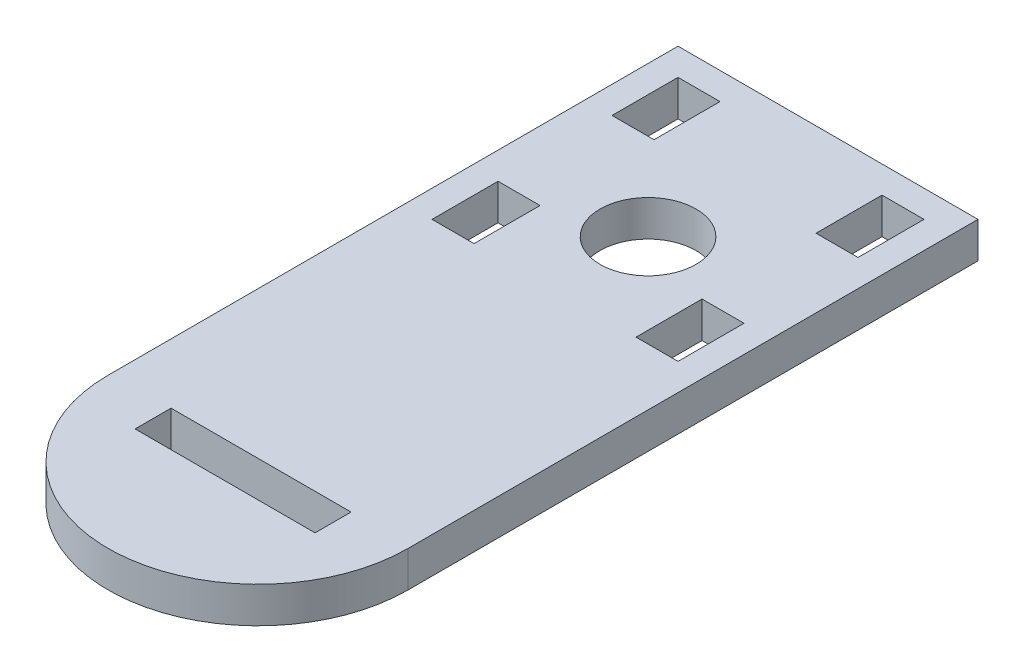
ISO-10303-21;
HEADER;
FILE_DESCRIPTION(('STEP AP214'),'2;1');
FILE_NAME('part.step','',(''),(''),'','','');
FILE_SCHEMA(('AUTOMOTIVE_DESIGN { 1 0 10303 214 1 1 1 1 }'));
ENDSEC;
DATA;
#1=APPLICATION_CONTEXT('core data for automotive mechanical design processes');
#2=APPLICATION_PROTOCOL_DEFINITION('international standard','automotive_design',2000,#1);
#3=PRODUCT_CONTEXT('',#1,'mechanical');
#4=PRODUCT('Part','Part','',(#3));
#5=PRODUCT_RELATED_PRODUCT_CATEGORY('part','',(#4));
#6=PRODUCT_DEFINITION_FORMATION('','',#4);
#7=PRODUCT_DEFINITION_CONTEXT('part definition',#1,'design');
#8=PRODUCT_DEFINITION('design','',#6,#7);
#9=PRODUCT_DEFINITION_SHAPE('','',#8);
#10=(LENGTH_UNIT() NAMED_UNIT(*) SI_UNIT(.MILLI.,.METRE.));
#11=(NAMED_UNIT(*) PLANE_ANGLE_UNIT() SI_UNIT($,.RADIAN.));
#12=(NAMED_UNIT(*) SI_UNIT($,.STERADIAN.) SOLID_ANGLE_UNIT());
#13=UNCERTAINTY_MEASURE_WITH_UNIT(LENGTH_MEASURE(1.E-05),#10,'distance_accuracy_value','');
#14=(GEOMETRIC_REPRESENTATION_CONTEXT(3) GLOBAL_UNCERTAINTY_ASSIGNED_CONTEXT((#13)) GLOBAL_UNIT_ASSIGNED_CONTEXT((#10,
#11,#12)) REPRESENTATION_CONTEXT('',''));
#15=CARTESIAN_POINT('',(0.,0.,0.));
#16=DIRECTION('',(0.,0.,1.));
#17=DIRECTION('',(1.,0.,0.));
#18=AXIS2_PLACEMENT_3D('',#15,#16,#17);
#19=CARTESIAN_POINT('',(-12.5,3.,47.5));
#20=DIRECTION('',(0.,1.,0.));
#21=DIRECTION('',(0.,0.,1.));
#22=AXIS2_PLACEMENT_3D('',#19,#20,#21);
#23=PLANE('',#22);
#24=DIRECTION('',(-1.,0.,0.));
#25=VECTOR('',#24,1.);
#26=CARTESIAN_POINT('',(-20.,3.,47.25));
#27=LINE('',#26,#25);
#28=CARTESIAN_POINT('',(-5.,3.,47.25));
#29=VERTEX_POINT('',#28);
#30=CARTESIAN_POINT('',(-20.,3.,47.25));
#31=VERTEX_POINT('',#30);
#32=EDGE_CURVE('E210',#29,#31,#27,.T.);
#33=ORIENTED_EDGE('',*,*,#32,.F.);
#34=DIRECTION('',(0.,0.,-1.));
#35=VECTOR('',#34,1.);
#36=CARTESIAN_POINT('',(-5.,3.,47.25));
#37=LINE('',#36,#35);
#38=CARTESIAN_POINT('',(-5.,3.,50.25));
#39=VERTEX_POINT('',#38);
#40=EDGE_CURVE('E201',#39,#29,#37,.T.);
#41=ORIENTED_EDGE('',*,*,#40,.F.);
#42=DIRECTION('',(1.,0.,0.));
#43=VECTOR('',#42,1.);
#44=CARTESIAN_POINT('',(-20.,3.,50.25));
#45=LINE('',#44,#43);
#46=CARTESIAN_POINT('',(-20.,3.,50.25));
#47=VERTEX_POINT('',#46);
#48=EDGE_CURVE('E228',#47,#39,#45,.T.);
#49=ORIENTED_EDGE('',*,*,#48,.F.);
#50=DIRECTION('',(0.,0.,1.));
#51=VECTOR('',#50,1.);
#52=CARTESIAN_POINT('',(-20.,3.,47.25));
#53=LINE('',#52,#51);
#54=EDGE_CURVE('E224',#31,#47,#53,.T.);
#55=ORIENTED_EDGE('',*,*,#54,.F.);
#56=EDGE_LOOP('',(#33,#41,#49,#55));
#57=FACE_BOUND('',#56,.T.);
#58=DIRECTION('',(1.,0.,0.));
#59=VECTOR('',#58,1.);
#60=CARTESIAN_POINT('',(-5.75,3.,22.75));
#61=LINE('',#60,#59);
#62=CARTESIAN_POINT('',(-5.75,3.,22.75));
#63=VERTEX_POINT('',#62);
#64=CARTESIAN_POINT('',(-2.25,3.,22.75));
#65=VERTEX_POINT('',#64);
#66=EDGE_CURVE('E255',#63,#65,#61,.T.);
#67=ORIENTED_EDGE('',*,*,#66,.F.);
#68=DIRECTION('',(0.,0.,1.));
#69=VECTOR('',#68,1.);
#70=CARTESIAN_POINT('',(-5.75,3.,17.25));
#71=LINE('',#70,#69);
#72=CARTESIAN_POINT('',(-5.75,3.,17.25));
#73=VERTEX_POINT('',#72);
#74=EDGE_CURVE('E252',#73,#63,#71,.T.);
#75=ORIENTED_EDGE('',*,*,#74,.F.);
#76=DIRECTION('',(-1.,0.,0.));
#77=VECTOR('',#76,1.);
#78=CARTESIAN_POINT('',(-5.75,3.,17.25));
#79=LINE('',#78,#77);
#80=CARTESIAN_POINT('',(-2.25,3.,17.25));
#81=VERTEX_POINT('',#80);
#82=EDGE_CURVE('E263',#81,#73,#79,.T.);
#83=ORIENTED_EDGE('',*,*,#82,.F.);
#84=DIRECTION('',(0.,0.,-1.));
#85=VECTOR('',#84,1.);
#86=CARTESIAN_POINT('',(-2.25,3.,17.25));
#87=LINE('',#86,#85);
#88=EDGE_CURVE('E259',#65,#81,#87,.T.);
#89=ORIENTED_EDGE('',*,*,#88,.F.);
#90=EDGE_LOOP('',(#67,#75,#83,#89));
#91=FACE_BOUND('',#90,.T.);
#92=DIRECTION('',(1.,0.,0.));
#93=VECTOR('',#92,1.);
#94=CARTESIAN_POINT('',(-22.75,3.,22.75));
#95=LINE('',#94,#93);
#96=CARTESIAN_POINT('',(-22.75,3.,22.75));
#97=VERTEX_POINT('',#96);
#98=CARTESIAN_POINT('',(-19.25,3.,22.75));
#99=VERTEX_POINT('',#98);
#100=EDGE_CURVE('E298',#97,#99,#95,.T.);
#101=ORIENTED_EDGE('',*,*,#100,.F.);
#102=DIRECTION('',(0.,0.,1.));
#103=VECTOR('',#102,1.);
#104=CARTESIAN_POINT('',(-22.75,3.,17.25));
#105=LINE('',#104,#103);
#106=CARTESIAN_POINT('',(-22.75,3.,17.25));
#107=VERTEX_POINT('',#106);
#108=EDGE_CURVE('E295',#107,#97,#105,.T.);
#109=ORIENTED_EDGE('',*,*,#108,.F.);
#110=DIRECTION('',(-1.,0.,0.));
#111=VECTOR('',#110,1.);
#112=CARTESIAN_POINT('',(-22.75,3.,17.25));
#113=LINE('',#112,#111);
#114=CARTESIAN_POINT('',(-19.25,3.,17.25));
#115=VERTEX_POINT('',#114);
#116=EDGE_CURVE('E306',#115,#107,#113,.T.);
#117=ORIENTED_EDGE('',*,*,#116,.F.);
#118=DIRECTION('',(0.,0.,-1.));
#119=VECTOR('',#118,1.);
#120=CARTESIAN_POINT('',(-19.25,3.,17.25));
#121=LINE('',#120,#119);
#122=EDGE_CURVE('E302',#99,#115,#121,.T.);
#123=ORIENTED_EDGE('',*,*,#122,.F.);
#124=EDGE_LOOP('',(#101,#109,#117,#123));
#125=FACE_BOUND('',#124,.T.);
#126=DIRECTION('',(1.,0.,0.));
#127=VECTOR('',#126,1.);
#128=CARTESIAN_POINT('',(-5.75,3.,7.75));
#129=LINE('',#128,#127);
#130=CARTESIAN_POINT('',(-5.75,3.,7.75));
#131=VERTEX_POINT('',#130);
#132=CARTESIAN_POINT('',(-2.25,3.,7.75));
#133=VERTEX_POINT('',#132);
#134=EDGE_CURVE('E341',#131,#133,#129,.T.);
#135=ORIENTED_EDGE('',*,*,#134,.F.);
#136=DIRECTION('',(0.,0.,1.));
#137=VECTOR('',#136,1.);
#138=CARTESIAN_POINT('',(-5.75,3.,2.25));
#139=LINE('',#138,#137);
#140=CARTESIAN_POINT('',(-5.75,3.,2.25));
#141=VERTEX_POINT('',#140);
#142=EDGE_CURVE('E338',#141,#131,#139,.T.);
#143=ORIENTED_EDGE('',*,*,#142,.F.);
#144=DIRECTION('',(-1.,0.,0.));
#145=VECTOR('',#144,1.);
#146=CARTESIAN_POINT('',(-5.75,3.,2.25));
#147=LINE('',#146,#145);
#148=CARTESIAN_POINT('',(-2.25,3.,2.25));
#149=VERTEX_POINT('',#148);
#150=EDGE_CURVE('E349',#149,#141,#147,.T.);
#151=ORIENTED_EDGE('',*,*,#150,.F.);
#152=DIRECTION('',(0.,0.,-1.));
#153=VECTOR('',#152,1.);
#154=CARTESIAN_POINT('',(-2.25,3.,2.25));
#155=LINE('',#154,#153);
#156=EDGE_CURVE('E345',#133,#149,#155,.T.);
#157=ORIENTED_EDGE('',*,*,#156,.F.);
#158=EDGE_LOOP('',(#135,#143,#151,#157));
#159=FACE_BOUND('',#158,.T.);
#160=DIRECTION('',(1.,0.,0.));
#161=VECTOR('',#160,1.);
#162=CARTESIAN_POINT('',(-22.75,3.,7.75));
#163=LINE('',#162,#161);
#164=CARTESIAN_POINT('',(-22.75,3.,7.75));
#165=VERTEX_POINT('',#164);
#166=CARTESIAN_POINT('',(-19.25,3.,7.75));
#167=VERTEX_POINT('',#166);
#168=EDGE_CURVE('E384',#165,#167,#163,.T.);
#169=ORIENTED_EDGE('',*,*,#168,.F.);
#170=DIRECTION('',(0.,0.,1.));
#171=VECTOR('',#170,1.);
#172=CARTESIAN_POINT('',(-22.75,3.,2.25));
#173=LINE('',#172,#171);
#174=CARTESIAN_POINT('',(-22.75,3.,2.25));
#175=VERTEX_POINT('',#174);
#176=EDGE_CURVE('E381',#175,#165,#173,.T.);
#177=ORIENTED_EDGE('',*,*,#176,.F.);
#178=DIRECTION('',(-1.,0.,0.));
#179=VECTOR('',#178,1.);
#180=CARTESIAN_POINT('',(-22.75,3.,2.25));
#181=LINE('',#180,#179);
#182=CARTESIAN_POINT('',(-19.25,3.,2.25));
#183=VERTEX_POINT('',#182);
#184=EDGE_CURVE('E392',#183,#175,#181,.T.);
#185=ORIENTED_EDGE('',*,*,#184,.F.);
#186=DIRECTION('',(0.,0.,-1.));
#187=VECTOR('',#186,1.);
#188=CARTESIAN_POINT('',(-19.25,3.,2.25));
#189=LINE('',#188,#187);
#190=EDGE_CURVE('E388',#167,#183,#189,.T.);
#191=ORIENTED_EDGE('',*,*,#190,.F.);
#192=EDGE_LOOP('',(#169,#177,#185,#191));
#193=FACE_BOUND('',#192,.T.);
#194=DIRECTION('',(0.,0.,-1.));
#195=VECTOR('',#194,1.);
#196=CARTESIAN_POINT('',(0.,3.,0.));
#197=LINE('',#196,#195);
#198=CARTESIAN_POINT('',(0.,3.,47.5));
#199=VERTEX_POINT('',#198);
#200=CARTESIAN_POINT('',(0.,3.,0.));
#201=VERTEX_POINT('',#200);
#202=EDGE_CURVE('E424',#199,#201,#197,.T.);
#203=ORIENTED_EDGE('',*,*,#202,.T.);
#204=DIRECTION('',(-1.,0.,0.));
#205=VECTOR('',#204,1.);
#206=CARTESIAN_POINT('',(0.,3.,0.));
#207=LINE('',#206,#205);
#208=CARTESIAN_POINT('',(-25.,3.,0.));
#209=VERTEX_POINT('',#208);
#210=EDGE_CURVE('E428',#201,#209,#207,.T.);
#211=ORIENTED_EDGE('',*,*,#210,.T.);
#212=DIRECTION('',(0.,0.,1.));
#213=VECTOR('',#212,1.);
#214=CARTESIAN_POINT('',(-25.,3.,0.));
#215=LINE('',#214,#213);
#216=CARTESIAN_POINT('',(-25.,3.,47.5));
#217=VERTEX_POINT('',#216);
#218=EDGE_CURVE('E432',#209,#217,#215,.T.);
#219=ORIENTED_EDGE('',*,*,#218,.T.);
#220=CARTESIAN_POINT('',(-12.5,3.,47.5));
#221=DIRECTION('',(0.,1.,0.));
#222=DIRECTION('',(0.,0.,1.));
#223=AXIS2_PLACEMENT_3D('',#220,#221,#222);
#224=CIRCLE('',#223,12.5);
#225=EDGE_CURVE('E435',#217,#199,#224,.T.);
#226=ORIENTED_EDGE('',*,*,#225,.T.);
#227=EDGE_LOOP('',(#203,#211,#219,#226));
#228=FACE_BOUND('',#227,.T.);
#229=CARTESIAN_POINT('',(-12.5,3.,15.));
#230=DIRECTION('',(0.,1.,0.));
#231=DIRECTION('',(0.,0.,1.));
#232=AXIS2_PLACEMENT_3D('',#229,#230,#231);
#233=CIRCLE('',#232,4.);
#234=CARTESIAN_POINT('',(-12.5,3.,19.));
#235=VERTEX_POINT('',#234);
#236=EDGE_CURVE('E236',#235,#235,#233,.T.);
#237=ORIENTED_EDGE('',*,*,#236,.F.);
#238=EDGE_LOOP('',(#237));
#239=FACE_BOUND('',#238,.T.);
#240=ADVANCED_FACE('F39',(#57,#91,#125,#159,#193,#228,#239),#23,.T.);
#241=CARTESIAN_POINT('',(-12.5,0.,47.5));
#242=DIRECTION('',(0.,1.,0.));
#243=DIRECTION('',(0.,0.,1.));
#244=AXIS2_PLACEMENT_3D('',#241,#242,#243);
#245=PLANE('',#244);
#246=DIRECTION('',(0.,0.,1.));
#247=VECTOR('',#246,1.);
#248=CARTESIAN_POINT('',(-5.75,0.,17.25));
#249=LINE('',#248,#247);
#250=CARTESIAN_POINT('',(-5.75,0.,17.25));
#251=VERTEX_POINT('',#250);
#252=CARTESIAN_POINT('',(-5.75,0.,22.75));
#253=VERTEX_POINT('',#252);
#254=EDGE_CURVE('E219',#251,#253,#249,.T.);
#255=ORIENTED_EDGE('',*,*,#254,.T.);
#256=DIRECTION('',(1.,0.,0.));
#257=VECTOR('',#256,1.);
#258=CARTESIAN_POINT('',(-5.75,0.,22.75));
#259=LINE('',#258,#257);
#260=CARTESIAN_POINT('',(-2.25,0.,22.75));
#261=VERTEX_POINT('',#260);
#262=EDGE_CURVE('E270',#253,#261,#259,.T.);
#263=ORIENTED_EDGE('',*,*,#262,.T.);
#264=DIRECTION('',(0.,0.,-1.));
#265=VECTOR('',#264,1.);
#266=CARTESIAN_POINT('',(-2.25,0.,17.25));
#267=LINE('',#266,#265);
#268=CARTESIAN_POINT('',(-2.25,0.,17.25));
#269=VERTEX_POINT('',#268);
#270=EDGE_CURVE('E274',#261,#269,#267,.T.);
#271=ORIENTED_EDGE('',*,*,#270,.T.);
#272=DIRECTION('',(-1.,0.,0.));
#273=VECTOR('',#272,1.);
#274=CARTESIAN_POINT('',(-5.75,0.,17.25));
#275=LINE('',#274,#273);
#276=EDGE_CURVE('E256',#269,#251,#275,.T.);
#277=ORIENTED_EDGE('',*,*,#276,.T.);
#278=EDGE_LOOP('',(#255,#263,#271,#277));
#279=FACE_BOUND('',#278,.T.);
#280=DIRECTION('',(0.,0.,1.));
#281=VECTOR('',#280,1.);
#282=CARTESIAN_POINT('',(-5.75,0.,2.25));
#283=LINE('',#282,#281);
#284=CARTESIAN_POINT('',(-5.75,0.,2.25));
#285=VERTEX_POINT('',#284);
#286=CARTESIAN_POINT('',(-5.75,0.,7.75));
#287=VERTEX_POINT('',#286);
#288=EDGE_CURVE('E337',#285,#287,#283,.T.);
#289=ORIENTED_EDGE('',*,*,#288,.T.);
#290=DIRECTION('',(1.,0.,0.));
#291=VECTOR('',#290,1.);
#292=CARTESIAN_POINT('',(-5.75,0.,7.75));
#293=LINE('',#292,#291);
#294=CARTESIAN_POINT('',(-2.25,0.,7.75));
#295=VERTEX_POINT('',#294);
#296=EDGE_CURVE('E356',#287,#295,#293,.T.);
#297=ORIENTED_EDGE('',*,*,#296,.T.);
#298=DIRECTION('',(0.,0.,-1.));
#299=VECTOR('',#298,1.);
#300=CARTESIAN_POINT('',(-2.25,0.,2.25));
#301=LINE('',#300,#299);
#302=CARTESIAN_POINT('',(-2.25,0.,2.25));
#303=VERTEX_POINT('',#302);
#304=EDGE_CURVE('E360',#295,#303,#301,.T.);
#305=ORIENTED_EDGE('',*,*,#304,.T.);
#306=DIRECTION('',(-1.,0.,0.));
#307=VECTOR('',#306,1.);
#308=CARTESIAN_POINT('',(-5.75,0.,2.25));
#309=LINE('',#308,#307);
#310=EDGE_CURVE('E342',#303,#285,#309,.T.);
#311=ORIENTED_EDGE('',*,*,#310,.T.);
#312=EDGE_LOOP('',(#289,#297,#305,#311));
#313=FACE_BOUND('',#312,.T.);
#314=DIRECTION('',(0.,0.,-1.));
#315=VECTOR('',#314,1.);
#316=CARTESIAN_POINT('',(0.,0.,0.));
#317=LINE('',#316,#315);
#318=CARTESIAN_POINT('',(0.,0.,47.5));
#319=VERTEX_POINT('',#318);
#320=CARTESIAN_POINT('',(0.,0.,0.));
#321=VERTEX_POINT('',#320);
#322=EDGE_CURVE('E423',#319,#321,#317,.T.);
#323=ORIENTED_EDGE('',*,*,#322,.F.);
#324=CARTESIAN_POINT('',(-12.5,0.,47.5));
#325=DIRECTION('',(0.,1.,0.));
#326=DIRECTION('',(0.,0.,1.));
#327=AXIS2_PLACEMENT_3D('',#324,#325,#326);
#328=CIRCLE('',#327,12.5);
#329=CARTESIAN_POINT('',(-25.,0.,47.5));
#330=VERTEX_POINT('',#329);
#331=EDGE_CURVE('E429',#330,#319,#328,.T.);
#332=ORIENTED_EDGE('',*,*,#331,.F.);
#333=DIRECTION('',(0.,0.,1.));
#334=VECTOR('',#333,1.);
#335=CARTESIAN_POINT('',(-25.,0.,0.));
#336=LINE('',#335,#334);
#337=CARTESIAN_POINT('',(-25.,0.,0.));
#338=VERTEX_POINT('',#337);
#339=EDGE_CURVE('E445',#338,#330,#336,.T.);
#340=ORIENTED_EDGE('',*,*,#339,.F.);
#341=DIRECTION('',(-1.,0.,0.));
#342=VECTOR('',#341,1.);
#343=CARTESIAN_POINT('',(0.,0.,0.));
#344=LINE('',#343,#342);
#345=EDGE_CURVE('E442',#321,#338,#344,.T.);
#346=ORIENTED_EDGE('',*,*,#345,.F.);
#347=EDGE_LOOP('',(#323,#332,#340,#346));
#348=FACE_BOUND('',#347,.T.);
#349=DIRECTION('',(0.,0.,1.));
#350=VECTOR('',#349,1.);
#351=CARTESIAN_POINT('',(-22.75,0.,2.25));
#352=LINE('',#351,#350);
#353=CARTESIAN_POINT('',(-22.75,0.,2.25));
#354=VERTEX_POINT('',#353);
#355=CARTESIAN_POINT('',(-22.75,0.,7.75));
#356=VERTEX_POINT('',#355);
#357=EDGE_CURVE('E380',#354,#356,#352,.T.);
#358=ORIENTED_EDGE('',*,*,#357,.T.);
#359=DIRECTION('',(1.,0.,0.));
#360=VECTOR('',#359,1.);
#361=CARTESIAN_POINT('',(-22.75,0.,7.75));
#362=LINE('',#361,#360);
#363=CARTESIAN_POINT('',(-19.25,0.,7.75));
#364=VERTEX_POINT('',#363);
#365=EDGE_CURVE('E399',#356,#364,#362,.T.);
#366=ORIENTED_EDGE('',*,*,#365,.T.);
#367=DIRECTION('',(0.,0.,-1.));
#368=VECTOR('',#367,1.);
#369=CARTESIAN_POINT('',(-19.25,0.,2.25));
#370=LINE('',#369,#368);
#371=CARTESIAN_POINT('',(-19.25,0.,2.25));
#372=VERTEX_POINT('',#371);
#373=EDGE_CURVE('E403',#364,#372,#370,.T.);
#374=ORIENTED_EDGE('',*,*,#373,.T.);
#375=DIRECTION('',(-1.,0.,0.));
#376=VECTOR('',#375,1.);
#377=CARTESIAN_POINT('',(-22.75,0.,2.25));
#378=LINE('',#377,#376);
#379=EDGE_CURVE('E385',#372,#354,#378,.T.);
#380=ORIENTED_EDGE('',*,*,#379,.T.);
#381=EDGE_LOOP('',(#358,#366,#374,#380));
#382=FACE_BOUND('',#381,.T.);
#383=DIRECTION('',(0.,0.,1.));
#384=VECTOR('',#383,1.);
#385=CARTESIAN_POINT('',(-22.75,0.,17.25));
#386=LINE('',#385,#384);
#387=CARTESIAN_POINT('',(-22.75,0.,17.25));
#388=VERTEX_POINT('',#387);
#389=CARTESIAN_POINT('',(-22.75,0.,22.75));
#390=VERTEX_POINT('',#389);
#391=EDGE_CURVE('E294',#388,#390,#386,.T.);
#392=ORIENTED_EDGE('',*,*,#391,.T.);
#393=DIRECTION('',(1.,0.,0.));
#394=VECTOR('',#393,1.);
#395=CARTESIAN_POINT('',(-22.75,0.,22.75));
#396=LINE('',#395,#394);
#397=CARTESIAN_POINT('',(-19.25,0.,22.75));
#398=VERTEX_POINT('',#397);
#399=EDGE_CURVE('E313',#390,#398,#396,.T.);
#400=ORIENTED_EDGE('',*,*,#399,.T.);
#401=DIRECTION('',(0.,0.,-1.));
#402=VECTOR('',#401,1.);
#403=CARTESIAN_POINT('',(-19.25,0.,17.25));
#404=LINE('',#403,#402);
#405=CARTESIAN_POINT('',(-19.25,0.,17.25));
#406=VERTEX_POINT('',#405);
#407=EDGE_CURVE('E317',#398,#406,#404,.T.);
#408=ORIENTED_EDGE('',*,*,#407,.T.);
#409=DIRECTION('',(-1.,0.,0.));
#410=VECTOR('',#409,1.);
#411=CARTESIAN_POINT('',(-22.75,0.,17.25));
#412=LINE('',#411,#410);
#413=EDGE_CURVE('E299',#406,#388,#412,.T.);
#414=ORIENTED_EDGE('',*,*,#413,.T.);
#415=EDGE_LOOP('',(#392,#400,#408,#414));
#416=FACE_BOUND('',#415,.T.);
#417=DIRECTION('',(0.,0.,-1.));
#418=VECTOR('',#417,1.);
#419=CARTESIAN_POINT('',(-5.,0.,47.25));
#420=LINE('',#419,#418);
#421=CARTESIAN_POINT('',(-5.,0.,50.25));
#422=VERTEX_POINT('',#421);
#423=CARTESIAN_POINT('',(-5.,0.,47.25));
#424=VERTEX_POINT('',#423);
#425=EDGE_CURVE('E63',#422,#424,#420,.T.);
#426=ORIENTED_EDGE('',*,*,#425,.T.);
#427=DIRECTION('',(-1.,0.,0.));
#428=VECTOR('',#427,1.);
#429=CARTESIAN_POINT('',(-20.,0.,47.25));
#430=LINE('',#429,#428);
#431=CARTESIAN_POINT('',(-20.,0.,47.25));
#432=VERTEX_POINT('',#431);
#433=EDGE_CURVE('E217',#424,#432,#430,.T.);
#434=ORIENTED_EDGE('',*,*,#433,.T.);
#435=DIRECTION('',(0.,0.,1.));
#436=VECTOR('',#435,1.);
#437=CARTESIAN_POINT('',(-20.,0.,47.25));
#438=LINE('',#437,#436);
#439=CARTESIAN_POINT('',(-20.,0.,50.25));
#440=VERTEX_POINT('',#439);
#441=EDGE_CURVE('E239',#432,#440,#438,.T.);
#442=ORIENTED_EDGE('',*,*,#441,.T.);
#443=DIRECTION('',(1.,0.,0.));
#444=VECTOR('',#443,1.);
#445=CARTESIAN_POINT('',(-20.,0.,50.25));
#446=LINE('',#445,#444);
#447=EDGE_CURVE('E211',#440,#422,#446,.T.);
#448=ORIENTED_EDGE('',*,*,#447,.T.);
#449=EDGE_LOOP('',(#426,#434,#442,#448));
#450=FACE_BOUND('',#449,.T.);
#451=CARTESIAN_POINT('',(-12.5,0.,15.));
#452=DIRECTION('',(0.,1.,0.));
#453=DIRECTION('',(0.,0.,1.));
#454=AXIS2_PLACEMENT_3D('',#451,#452,#453);
#455=CIRCLE('',#454,4.);
#456=CARTESIAN_POINT('',(-12.5,0.,19.));
#457=VERTEX_POINT('',#456);
#458=EDGE_CURVE('E598',#457,#457,#455,.T.);
#459=ORIENTED_EDGE('',*,*,#458,.T.);
#460=EDGE_LOOP('',(#459));
#461=FACE_BOUND('',#460,.T.);
#462=ADVANCED_FACE('F468',(#279,#313,#348,#382,#416,#450,#461),#245,.F.);
#463=CARTESIAN_POINT('',(0.,3.,0.));
#464=DIRECTION('',(-1.,0.,0.));
#465=DIRECTION('',(0.,0.,1.));
#466=AXIS2_PLACEMENT_3D('',#463,#464,#465);
#467=PLANE('',#466);
#468=ORIENTED_EDGE('',*,*,#322,.T.);
#469=DIRECTION('',(0.,-1.,0.));
#470=VECTOR('',#469,1.);
#471=CARTESIAN_POINT('',(0.,3.,0.));
#472=LINE('',#471,#470);
#473=EDGE_CURVE('E11',#201,#321,#472,.T.);
#474=ORIENTED_EDGE('',*,*,#473,.F.);
#475=ORIENTED_EDGE('',*,*,#202,.F.);
#476=DIRECTION('',(0.,-1.,0.));
#477=VECTOR('',#476,1.);
#478=CARTESIAN_POINT('',(0.,3.,47.5));
#479=LINE('',#478,#477);
#480=EDGE_CURVE('E438',#199,#319,#479,.T.);
#481=ORIENTED_EDGE('',*,*,#480,.T.);
#482=EDGE_LOOP('',(#468,#474,#475,#481));
#483=FACE_BOUND('',#482,.T.);
#484=ADVANCED_FACE('F41',(#483),#467,.F.);
#485=CARTESIAN_POINT('',(0.,3.,0.));
#486=DIRECTION('',(0.,0.,1.));
#487=DIRECTION('',(1.,0.,0.));
#488=AXIS2_PLACEMENT_3D('',#485,#486,#487);
#489=PLANE('',#488);
#490=ORIENTED_EDGE('',*,*,#345,.T.);
#491=DIRECTION('',(0.,-1.,0.));
#492=VECTOR('',#491,1.);
#493=CARTESIAN_POINT('',(-25.,3.,0.));
#494=LINE('',#493,#492);
#495=EDGE_CURVE('E48',#209,#338,#494,.T.);
#496=ORIENTED_EDGE('',*,*,#495,.F.);
#497=ORIENTED_EDGE('',*,*,#210,.F.);
#498=ORIENTED_EDGE('',*,*,#473,.T.);
#499=EDGE_LOOP('',(#490,#496,#497,#498));
#500=FACE_BOUND('',#499,.T.);
#501=ADVANCED_FACE('F479',(#500),#489,.F.);
#502=CARTESIAN_POINT('',(-25.,3.,0.));
#503=DIRECTION('',(1.,0.,0.));
#504=DIRECTION('',(0.,0.,-1.));
#505=AXIS2_PLACEMENT_3D('',#502,#503,#504);
#506=PLANE('',#505);
#507=ORIENTED_EDGE('',*,*,#339,.T.);
#508=DIRECTION('',(0.,-1.,0.));
#509=VECTOR('',#508,1.);
#510=CARTESIAN_POINT('',(-25.,3.,47.5));
#511=LINE('',#510,#509);
#512=EDGE_CURVE('E453',#217,#330,#511,.T.);
#513=ORIENTED_EDGE('',*,*,#512,.F.);
#514=ORIENTED_EDGE('',*,*,#218,.F.);
#515=ORIENTED_EDGE('',*,*,#495,.T.);
#516=EDGE_LOOP('',(#507,#513,#514,#515));
#517=FACE_BOUND('',#516,.T.);
#518=ADVANCED_FACE('F462',(#517),#506,.F.);
#519=CARTESIAN_POINT('',(-12.5,3.,47.5));
#520=DIRECTION('',(0.,-1.,0.));
#521=DIRECTION('',(0.,0.,-1.));
#522=AXIS2_PLACEMENT_3D('',#519,#520,#521);
#523=CYLINDRICAL_SURFACE('',#522,12.5);
#524=ORIENTED_EDGE('',*,*,#331,.T.);
#525=ORIENTED_EDGE('',*,*,#480,.F.);
#526=ORIENTED_EDGE('',*,*,#225,.F.);
#527=ORIENTED_EDGE('',*,*,#512,.T.);
#528=EDGE_LOOP('',(#524,#525,#526,#527));
#529=FACE_BOUND('',#528,.T.);
#530=ADVANCED_FACE('F472',(#529),#523,.T.);
#531=CARTESIAN_POINT('',(-22.75,3.,2.25));
#532=DIRECTION('',(1.,0.,0.));
#533=DIRECTION('',(0.,0.,-1.));
#534=AXIS2_PLACEMENT_3D('',#531,#532,#533);
#535=PLANE('',#534);
#536=ORIENTED_EDGE('',*,*,#357,.F.);
#537=DIRECTION('',(0.,-1.,0.));
#538=VECTOR('',#537,1.);
#539=CARTESIAN_POINT('',(-22.75,3.,2.25));
#540=LINE('',#539,#538);
#541=EDGE_CURVE('E395',#175,#354,#540,.T.);
#542=ORIENTED_EDGE('',*,*,#541,.F.);
#543=ORIENTED_EDGE('',*,*,#176,.T.);
#544=DIRECTION('',(0.,-1.,0.));
#545=VECTOR('',#544,1.);
#546=CARTESIAN_POINT('',(-22.75,3.,7.75));
#547=LINE('',#546,#545);
#548=EDGE_CURVE('E419',#165,#356,#547,.T.);
#549=ORIENTED_EDGE('',*,*,#548,.T.);
#550=EDGE_LOOP('',(#536,#542,#543,#549));
#551=FACE_BOUND('',#550,.T.);
#552=ADVANCED_FACE('F494',(#551),#535,.T.);
#553=CARTESIAN_POINT('',(-22.75,3.,7.75));
#554=DIRECTION('',(0.,0.,-1.));
#555=DIRECTION('',(-1.,0.,0.));
#556=AXIS2_PLACEMENT_3D('',#553,#554,#555);
#557=PLANE('',#556);
#558=ORIENTED_EDGE('',*,*,#365,.F.);
#559=ORIENTED_EDGE('',*,*,#548,.F.);
#560=ORIENTED_EDGE('',*,*,#168,.T.);
#561=DIRECTION('',(0.,-1.,0.));
#562=VECTOR('',#561,1.);
#563=CARTESIAN_POINT('',(-19.25,3.,7.75));
#564=LINE('',#563,#562);
#565=EDGE_CURVE('E416',#167,#364,#564,.T.);
#566=ORIENTED_EDGE('',*,*,#565,.T.);
#567=EDGE_LOOP('',(#558,#559,#560,#566));
#568=FACE_BOUND('',#567,.T.);
#569=ADVANCED_FACE('F501',(#568),#557,.T.);
#570=CARTESIAN_POINT('',(-19.25,3.,2.25));
#571=DIRECTION('',(-1.,0.,0.));
#572=DIRECTION('',(0.,0.,1.));
#573=AXIS2_PLACEMENT_3D('',#570,#571,#572);
#574=PLANE('',#573);
#575=ORIENTED_EDGE('',*,*,#373,.F.);
#576=ORIENTED_EDGE('',*,*,#565,.F.);
#577=ORIENTED_EDGE('',*,*,#190,.T.);
#578=DIRECTION('',(0.,-1.,0.));
#579=VECTOR('',#578,1.);
#580=CARTESIAN_POINT('',(-19.25,3.,2.25));
#581=LINE('',#580,#579);
#582=EDGE_CURVE('E413',#183,#372,#581,.T.);
#583=ORIENTED_EDGE('',*,*,#582,.T.);
#584=EDGE_LOOP('',(#575,#576,#577,#583));
#585=FACE_BOUND('',#584,.T.);
#586=ADVANCED_FACE('F506',(#585),#574,.T.);
#587=CARTESIAN_POINT('',(-22.75,3.,2.25));
#588=DIRECTION('',(0.,0.,1.));
#589=DIRECTION('',(1.,0.,0.));
#590=AXIS2_PLACEMENT_3D('',#587,#588,#589);
#591=PLANE('',#590);
#592=ORIENTED_EDGE('',*,*,#379,.F.);
#593=ORIENTED_EDGE('',*,*,#582,.F.);
#594=ORIENTED_EDGE('',*,*,#184,.T.);
#595=ORIENTED_EDGE('',*,*,#541,.T.);
#596=EDGE_LOOP('',(#592,#593,#594,#595));
#597=FACE_BOUND('',#596,.T.);
#598=ADVANCED_FACE('F513',(#597),#591,.T.);
#599=CARTESIAN_POINT('',(-5.75,3.,2.25));
#600=DIRECTION('',(1.,0.,0.));
#601=DIRECTION('',(0.,0.,-1.));
#602=AXIS2_PLACEMENT_3D('',#599,#600,#601);
#603=PLANE('',#602);
#604=ORIENTED_EDGE('',*,*,#288,.F.);
#605=DIRECTION('',(0.,-1.,0.));
#606=VECTOR('',#605,1.);
#607=CARTESIAN_POINT('',(-5.75,3.,2.25));
#608=LINE('',#607,#606);
#609=EDGE_CURVE('E352',#141,#285,#608,.T.);
#610=ORIENTED_EDGE('',*,*,#609,.F.);
#611=ORIENTED_EDGE('',*,*,#142,.T.);
#612=DIRECTION('',(0.,-1.,0.));
#613=VECTOR('',#612,1.);
#614=CARTESIAN_POINT('',(-5.75,3.,7.75));
#615=LINE('',#614,#613);
#616=EDGE_CURVE('E376',#131,#287,#615,.T.);
#617=ORIENTED_EDGE('',*,*,#616,.T.);
#618=EDGE_LOOP('',(#604,#610,#611,#617));
#619=FACE_BOUND('',#618,.T.);
#620=ADVANCED_FACE('F527',(#619),#603,.T.);
#621=CARTESIAN_POINT('',(-5.75,3.,7.75));
#622=DIRECTION('',(0.,0.,-1.));
#623=DIRECTION('',(-1.,0.,0.));
#624=AXIS2_PLACEMENT_3D('',#621,#622,#623);
#625=PLANE('',#624);
#626=ORIENTED_EDGE('',*,*,#296,.F.);
#627=ORIENTED_EDGE('',*,*,#616,.F.);
#628=ORIENTED_EDGE('',*,*,#134,.T.);
#629=DIRECTION('',(0.,-1.,0.));
#630=VECTOR('',#629,1.);
#631=CARTESIAN_POINT('',(-2.25,3.,7.75));
#632=LINE('',#631,#630);
#633=EDGE_CURVE('E373',#133,#295,#632,.T.);
#634=ORIENTED_EDGE('',*,*,#633,.T.);
#635=EDGE_LOOP('',(#626,#627,#628,#634));
#636=FACE_BOUND('',#635,.T.);
#637=ADVANCED_FACE('F532',(#636),#625,.T.);
#638=CARTESIAN_POINT('',(-2.25,3.,2.25));
#639=DIRECTION('',(-1.,0.,0.));
#640=DIRECTION('',(0.,0.,1.));
#641=AXIS2_PLACEMENT_3D('',#638,#639,#640);
#642=PLANE('',#641);
#643=ORIENTED_EDGE('',*,*,#304,.F.);
#644=ORIENTED_EDGE('',*,*,#633,.F.);
#645=ORIENTED_EDGE('',*,*,#156,.T.);
#646=DIRECTION('',(0.,-1.,0.));
#647=VECTOR('',#646,1.);
#648=CARTESIAN_POINT('',(-2.25,3.,2.25));
#649=LINE('',#648,#647);
#650=EDGE_CURVE('E370',#149,#303,#649,.T.);
#651=ORIENTED_EDGE('',*,*,#650,.T.);
#652=EDGE_LOOP('',(#643,#644,#645,#651));
#653=FACE_BOUND('',#652,.T.);
#654=ADVANCED_FACE('F536',(#653),#642,.T.);
#655=CARTESIAN_POINT('',(-5.75,3.,2.25));
#656=DIRECTION('',(0.,0.,1.));
#657=DIRECTION('',(1.,0.,0.));
#658=AXIS2_PLACEMENT_3D('',#655,#656,#657);
#659=PLANE('',#658);
#660=ORIENTED_EDGE('',*,*,#310,.F.);
#661=ORIENTED_EDGE('',*,*,#650,.F.);
#662=ORIENTED_EDGE('',*,*,#150,.T.);
#663=ORIENTED_EDGE('',*,*,#609,.T.);
#664=EDGE_LOOP('',(#660,#661,#662,#663));
#665=FACE_BOUND('',#664,.T.);
#666=ADVANCED_FACE('F540',(#665),#659,.T.);
#667=CARTESIAN_POINT('',(-22.75,3.,17.25));
#668=DIRECTION('',(1.,0.,0.));
#669=DIRECTION('',(0.,0.,-1.));
#670=AXIS2_PLACEMENT_3D('',#667,#668,#669);
#671=PLANE('',#670);
#672=ORIENTED_EDGE('',*,*,#391,.F.);
#673=DIRECTION('',(0.,-1.,0.));
#674=VECTOR('',#673,1.);
#675=CARTESIAN_POINT('',(-22.75,3.,17.25));
#676=LINE('',#675,#674);
#677=EDGE_CURVE('E309',#107,#388,#676,.T.);
#678=ORIENTED_EDGE('',*,*,#677,.F.);
#679=ORIENTED_EDGE('',*,*,#108,.T.);
#680=DIRECTION('',(0.,-1.,0.));
#681=VECTOR('',#680,1.);
#682=CARTESIAN_POINT('',(-22.75,3.,22.75));
#683=LINE('',#682,#681);
#684=EDGE_CURVE('E333',#97,#390,#683,.T.);
#685=ORIENTED_EDGE('',*,*,#684,.T.);
#686=EDGE_LOOP('',(#672,#678,#679,#685));
#687=FACE_BOUND('',#686,.T.);
#688=ADVANCED_FACE('F544',(#687),#671,.T.);
#689=CARTESIAN_POINT('',(-22.75,3.,22.75));
#690=DIRECTION('',(0.,0.,-1.));
#691=DIRECTION('',(-1.,0.,0.));
#692=AXIS2_PLACEMENT_3D('',#689,#690,#691);
#693=PLANE('',#692);
#694=ORIENTED_EDGE('',*,*,#399,.F.);
#695=ORIENTED_EDGE('',*,*,#684,.F.);
#696=ORIENTED_EDGE('',*,*,#100,.T.);
#697=DIRECTION('',(0.,-1.,0.));
#698=VECTOR('',#697,1.);
#699=CARTESIAN_POINT('',(-19.25,3.,22.75));
#700=LINE('',#699,#698);
#701=EDGE_CURVE('E330',#99,#398,#700,.T.);
#702=ORIENTED_EDGE('',*,*,#701,.T.);
#703=EDGE_LOOP('',(#694,#695,#696,#702));
#704=FACE_BOUND('',#703,.T.);
#705=ADVANCED_FACE('F548',(#704),#693,.T.);
#706=CARTESIAN_POINT('',(-19.25,3.,17.25));
#707=DIRECTION('',(-1.,0.,0.));
#708=DIRECTION('',(0.,0.,1.));
#709=AXIS2_PLACEMENT_3D('',#706,#707,#708);
#710=PLANE('',#709);
#711=ORIENTED_EDGE('',*,*,#407,.F.);
#712=ORIENTED_EDGE('',*,*,#701,.F.);
#713=ORIENTED_EDGE('',*,*,#122,.T.);
#714=DIRECTION('',(0.,-1.,0.));
#715=VECTOR('',#714,1.);
#716=CARTESIAN_POINT('',(-19.25,3.,17.25));
#717=LINE('',#716,#715);
#718=EDGE_CURVE('E327',#115,#406,#717,.T.);
#719=ORIENTED_EDGE('',*,*,#718,.T.);
#720=EDGE_LOOP('',(#711,#712,#713,#719));
#721=FACE_BOUND('',#720,.T.);
#722=ADVANCED_FACE('F552',(#721),#710,.T.);
#723=CARTESIAN_POINT('',(-22.75,3.,17.25));
#724=DIRECTION('',(0.,0.,1.));
#725=DIRECTION('',(1.,0.,0.));
#726=AXIS2_PLACEMENT_3D('',#723,#724,#725);
#727=PLANE('',#726);
#728=ORIENTED_EDGE('',*,*,#413,.F.);
#729=ORIENTED_EDGE('',*,*,#718,.F.);
#730=ORIENTED_EDGE('',*,*,#116,.T.);
#731=ORIENTED_EDGE('',*,*,#677,.T.);
#732=EDGE_LOOP('',(#728,#729,#730,#731));
#733=FACE_BOUND('',#732,.T.);
#734=ADVANCED_FACE('F556',(#733),#727,.T.);
#735=CARTESIAN_POINT('',(-5.75,3.,17.25));
#736=DIRECTION('',(1.,0.,0.));
#737=DIRECTION('',(0.,0.,-1.));
#738=AXIS2_PLACEMENT_3D('',#735,#736,#737);
#739=PLANE('',#738);
#740=ORIENTED_EDGE('',*,*,#254,.F.);
#741=DIRECTION('',(0.,-1.,0.));
#742=VECTOR('',#741,1.);
#743=CARTESIAN_POINT('',(-5.75,3.,17.25));
#744=LINE('',#743,#742);
#745=EDGE_CURVE('E266',#73,#251,#744,.T.);
#746=ORIENTED_EDGE('',*,*,#745,.F.);
#747=ORIENTED_EDGE('',*,*,#74,.T.);
#748=DIRECTION('',(0.,-1.,0.));
#749=VECTOR('',#748,1.);
#750=CARTESIAN_POINT('',(-5.75,3.,22.75));
#751=LINE('',#750,#749);
#752=EDGE_CURVE('E290',#63,#253,#751,.T.);
#753=ORIENTED_EDGE('',*,*,#752,.T.);
#754=EDGE_LOOP('',(#740,#746,#747,#753));
#755=FACE_BOUND('',#754,.T.);
#756=ADVANCED_FACE('F560',(#755),#739,.T.);
#757=CARTESIAN_POINT('',(-5.75,3.,22.75));
#758=DIRECTION('',(0.,0.,-1.));
#759=DIRECTION('',(-1.,0.,0.));
#760=AXIS2_PLACEMENT_3D('',#757,#758,#759);
#761=PLANE('',#760);
#762=ORIENTED_EDGE('',*,*,#262,.F.);
#763=ORIENTED_EDGE('',*,*,#752,.F.);
#764=ORIENTED_EDGE('',*,*,#66,.T.);
#765=DIRECTION('',(0.,-1.,0.));
#766=VECTOR('',#765,1.);
#767=CARTESIAN_POINT('',(-2.25,3.,22.75));
#768=LINE('',#767,#766);
#769=EDGE_CURVE('E287',#65,#261,#768,.T.);
#770=ORIENTED_EDGE('',*,*,#769,.T.);
#771=EDGE_LOOP('',(#762,#763,#764,#770));
#772=FACE_BOUND('',#771,.T.);
#773=ADVANCED_FACE('F564',(#772),#761,.T.);
#774=CARTESIAN_POINT('',(-2.25,3.,17.25));
#775=DIRECTION('',(-1.,0.,0.));
#776=DIRECTION('',(0.,0.,1.));
#777=AXIS2_PLACEMENT_3D('',#774,#775,#776);
#778=PLANE('',#777);
#779=ORIENTED_EDGE('',*,*,#270,.F.);
#780=ORIENTED_EDGE('',*,*,#769,.F.);
#781=ORIENTED_EDGE('',*,*,#88,.T.);
#782=DIRECTION('',(0.,-1.,0.));
#783=VECTOR('',#782,1.);
#784=CARTESIAN_POINT('',(-2.25,3.,17.25));
#785=LINE('',#784,#783);
#786=EDGE_CURVE('E284',#81,#269,#785,.T.);
#787=ORIENTED_EDGE('',*,*,#786,.T.);
#788=EDGE_LOOP('',(#779,#780,#781,#787));
#789=FACE_BOUND('',#788,.T.);
#790=ADVANCED_FACE('F568',(#789),#778,.T.);
#791=CARTESIAN_POINT('',(-5.75,3.,17.25));
#792=DIRECTION('',(0.,0.,1.));
#793=DIRECTION('',(1.,0.,0.));
#794=AXIS2_PLACEMENT_3D('',#791,#792,#793);
#795=PLANE('',#794);
#796=ORIENTED_EDGE('',*,*,#276,.F.);
#797=ORIENTED_EDGE('',*,*,#786,.F.);
#798=ORIENTED_EDGE('',*,*,#82,.T.);
#799=ORIENTED_EDGE('',*,*,#745,.T.);
#800=EDGE_LOOP('',(#796,#797,#798,#799));
#801=FACE_BOUND('',#800,.T.);
#802=ADVANCED_FACE('F572',(#801),#795,.T.);
#803=CARTESIAN_POINT('',(-5.,3.,47.25));
#804=DIRECTION('',(-1.,0.,0.));
#805=DIRECTION('',(0.,0.,1.));
#806=AXIS2_PLACEMENT_3D('',#803,#804,#805);
#807=PLANE('',#806);
#808=ORIENTED_EDGE('',*,*,#425,.F.);
#809=DIRECTION('',(0.,-1.,0.));
#810=VECTOR('',#809,1.);
#811=CARTESIAN_POINT('',(-5.,3.,50.25));
#812=LINE('',#811,#810);
#813=EDGE_CURVE('E205',#39,#422,#812,.T.);
#814=ORIENTED_EDGE('',*,*,#813,.F.);
#815=ORIENTED_EDGE('',*,*,#40,.T.);
#816=DIRECTION('',(0.,-1.,0.));
#817=VECTOR('',#816,1.);
#818=CARTESIAN_POINT('',(-5.,3.,47.25));
#819=LINE('',#818,#817);
#820=EDGE_CURVE('E204',#29,#424,#819,.T.);
#821=ORIENTED_EDGE('',*,*,#820,.T.);
#822=EDGE_LOOP('',(#808,#814,#815,#821));
#823=FACE_BOUND('',#822,.T.);
#824=ADVANCED_FACE('F203',(#823),#807,.T.);
#825=CARTESIAN_POINT('',(-20.,3.,47.25));
#826=DIRECTION('',(0.,0.,1.));
#827=DIRECTION('',(1.,0.,0.));
#828=AXIS2_PLACEMENT_3D('',#825,#826,#827);
#829=PLANE('',#828);
#830=ORIENTED_EDGE('',*,*,#433,.F.);
#831=ORIENTED_EDGE('',*,*,#820,.F.);
#832=ORIENTED_EDGE('',*,*,#32,.T.);
#833=DIRECTION('',(0.,-1.,0.));
#834=VECTOR('',#833,1.);
#835=CARTESIAN_POINT('',(-20.,3.,47.25));
#836=LINE('',#835,#834);
#837=EDGE_CURVE('E220',#31,#432,#836,.T.);
#838=ORIENTED_EDGE('',*,*,#837,.T.);
#839=EDGE_LOOP('',(#830,#831,#832,#838));
#840=FACE_BOUND('',#839,.T.);
#841=ADVANCED_FACE('F214',(#840),#829,.T.);
#842=CARTESIAN_POINT('',(-20.,3.,47.25));
#843=DIRECTION('',(1.,0.,0.));
#844=DIRECTION('',(0.,0.,-1.));
#845=AXIS2_PLACEMENT_3D('',#842,#843,#844);
#846=PLANE('',#845);
#847=ORIENTED_EDGE('',*,*,#441,.F.);
#848=ORIENTED_EDGE('',*,*,#837,.F.);
#849=ORIENTED_EDGE('',*,*,#54,.T.);
#850=DIRECTION('',(0.,-1.,0.));
#851=VECTOR('',#850,1.);
#852=CARTESIAN_POINT('',(-20.,3.,50.25));
#853=LINE('',#852,#851);
#854=EDGE_CURVE('E55',#47,#440,#853,.T.);
#855=ORIENTED_EDGE('',*,*,#854,.T.);
#856=EDGE_LOOP('',(#847,#848,#849,#855));
#857=FACE_BOUND('',#856,.T.);
#858=ADVANCED_FACE('F581',(#857),#846,.T.);
#859=CARTESIAN_POINT('',(-20.,3.,50.25));
#860=DIRECTION('',(0.,0.,-1.));
#861=DIRECTION('',(-1.,0.,0.));
#862=AXIS2_PLACEMENT_3D('',#859,#860,#861);
#863=PLANE('',#862);
#864=ORIENTED_EDGE('',*,*,#447,.F.);
#865=ORIENTED_EDGE('',*,*,#854,.F.);
#866=ORIENTED_EDGE('',*,*,#48,.T.);
#867=ORIENTED_EDGE('',*,*,#813,.T.);
#868=EDGE_LOOP('',(#864,#865,#866,#867));
#869=FACE_BOUND('',#868,.T.);
#870=ADVANCED_FACE('F584',(#869),#863,.T.);
#871=CARTESIAN_POINT('',(-12.5,3.,15.));
#872=DIRECTION('',(0.,-1.,0.));
#873=DIRECTION('',(0.,0.,-1.));
#874=AXIS2_PLACEMENT_3D('',#871,#872,#873);
#875=CYLINDRICAL_SURFACE('',#874,4.);
#876=ORIENTED_EDGE('',*,*,#236,.T.);
#877=EDGE_LOOP('',(#876));
#878=FACE_BOUND('',#877,.T.);
#879=ORIENTED_EDGE('',*,*,#458,.F.);
#880=EDGE_LOOP('',(#879));
#881=FACE_BOUND('',#880,.T.);
#882=ADVANCED_FACE('F588',(#878,#881),#875,.F.);
#883=CLOSED_SHELL('',(#240,#462,#484,#501,#518,#530,#552,#569,#586,#598,#620,#637,#654,#666,
#688,#705,#722,#734,#756,#773,#790,#802,#824,#841,#858,#870,#882));
#884=MANIFOLD_SOLID_BREP('B2',#883);
#885=ADVANCED_BREP_SHAPE_REPRESENTATION('',(#18,#884),#14);
#886=SHAPE_DEFINITION_REPRESENTATION(#9,#885);
ENDSEC;
END-ISO-10303-21;
